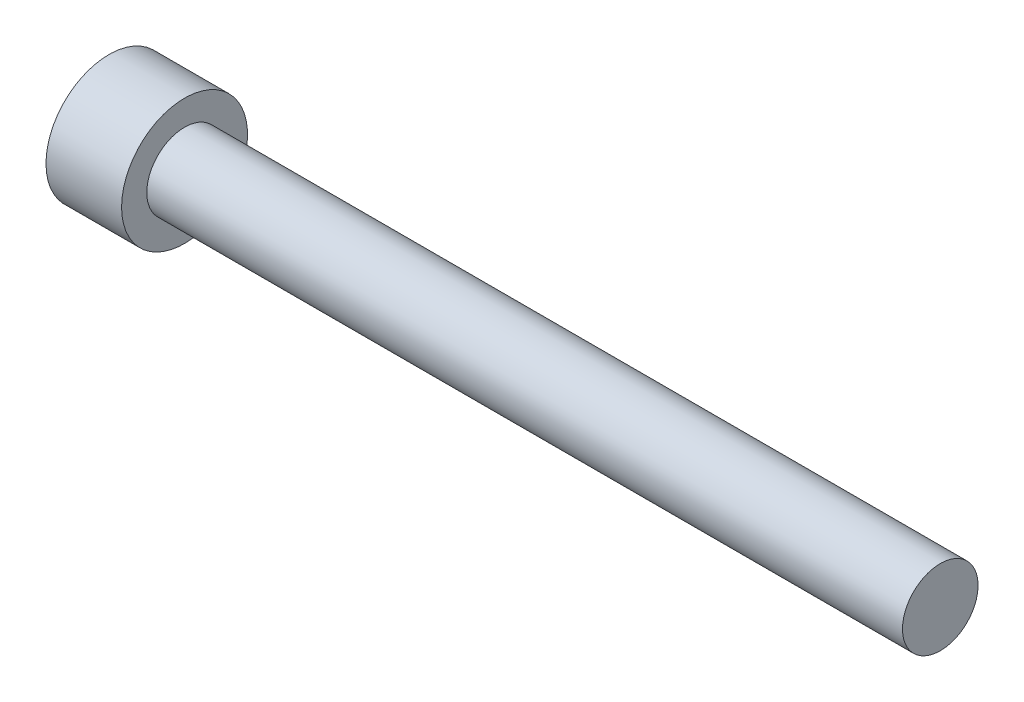
ISO-10303-21;
HEADER;
FILE_DESCRIPTION(('STEP AP214'),'2;1');
FILE_NAME('part.step','',(''),(''),'','','');
FILE_SCHEMA(('AUTOMOTIVE_DESIGN { 1 0 10303 214 1 1 1 1 }'));
ENDSEC;
DATA;
#1=APPLICATION_CONTEXT('core data for automotive mechanical design processes');
#2=APPLICATION_PROTOCOL_DEFINITION('international standard','automotive_design',2000,#1);
#3=PRODUCT_CONTEXT('',#1,'mechanical');
#4=PRODUCT('Part','Part','',(#3));
#5=PRODUCT_RELATED_PRODUCT_CATEGORY('part','',(#4));
#6=PRODUCT_DEFINITION_FORMATION('','',#4);
#7=PRODUCT_DEFINITION_CONTEXT('part definition',#1,'design');
#8=PRODUCT_DEFINITION('design','',#6,#7);
#9=PRODUCT_DEFINITION_SHAPE('','',#8);
#10=(LENGTH_UNIT() NAMED_UNIT(*) SI_UNIT(.MILLI.,.METRE.));
#11=(NAMED_UNIT(*) PLANE_ANGLE_UNIT() SI_UNIT($,.RADIAN.));
#12=(NAMED_UNIT(*) SI_UNIT($,.STERADIAN.) SOLID_ANGLE_UNIT());
#13=UNCERTAINTY_MEASURE_WITH_UNIT(LENGTH_MEASURE(1.E-05),#10,'distance_accuracy_value','');
#14=(GEOMETRIC_REPRESENTATION_CONTEXT(3) GLOBAL_UNCERTAINTY_ASSIGNED_CONTEXT((#13)) GLOBAL_UNIT_ASSIGNED_CONTEXT((#10,
#11,#12)) REPRESENTATION_CONTEXT('',''));
#15=CARTESIAN_POINT('',(0.,0.,0.));
#16=DIRECTION('',(0.,0.,1.));
#17=DIRECTION('',(1.,0.,0.));
#18=AXIS2_PLACEMENT_3D('',#15,#16,#17);
#19=CARTESIAN_POINT('',(-6.,0.,0.));
#20=DIRECTION('',(1.,0.,0.));
#21=DIRECTION('',(0.,0.,-1.));
#22=AXIS2_PLACEMENT_3D('',#19,#20,#21);
#23=PLANE('',#22);
#24=CARTESIAN_POINT('',(-6.00000000000001,0.,0.));
#25=DIRECTION('',(-1.,0.,0.));
#26=DIRECTION('',(0.,0.,1.));
#27=AXIS2_PLACEMENT_3D('',#24,#25,#26);
#28=CIRCLE('',#27,5.);
#29=CARTESIAN_POINT('',(-6.00000000000001,0.,5.));
#30=VERTEX_POINT('',#29);
#31=EDGE_CURVE('E11',#30,#30,#28,.T.);
#32=ORIENTED_EDGE('',*,*,#31,.T.);
#33=EDGE_LOOP('',(#32));
#34=FACE_BOUND('',#33,.T.);
#35=DIRECTION('',(0.,0.866025403784439,-0.5));
#36=VECTOR('',#35,1.);
#37=CARTESIAN_POINT('',(-6.,-2.5,-1.44337567297406));
#38=LINE('',#37,#36);
#39=CARTESIAN_POINT('',(-6.,-2.5,-1.44337567297406));
#40=VERTEX_POINT('',#39);
#41=CARTESIAN_POINT('',(-6.,0.,-2.88675134594813));
#42=VERTEX_POINT('',#41);
#43=EDGE_CURVE('E54',#40,#42,#38,.T.);
#44=ORIENTED_EDGE('',*,*,#43,.T.);
#45=DIRECTION('',(0.,0.866025403784439,0.5));
#46=VECTOR('',#45,1.);
#47=CARTESIAN_POINT('',(-6.,0.,-2.88675134594813));
#48=LINE('',#47,#46);
#49=CARTESIAN_POINT('',(-6.,2.5,-1.44337567297406));
#50=VERTEX_POINT('',#49);
#51=EDGE_CURVE('E127',#42,#50,#48,.T.);
#52=ORIENTED_EDGE('',*,*,#51,.T.);
#53=DIRECTION('',(0.,0.,1.));
#54=VECTOR('',#53,1.);
#55=CARTESIAN_POINT('',(-6.,2.5,-1.44337567297406));
#56=LINE('',#55,#54);
#57=CARTESIAN_POINT('',(-6.,2.5,1.44337567297406));
#58=VERTEX_POINT('',#57);
#59=EDGE_CURVE('E129',#50,#58,#56,.T.);
#60=ORIENTED_EDGE('',*,*,#59,.T.);
#61=DIRECTION('',(0.,-0.866025403784439,0.5));
#62=VECTOR('',#61,1.);
#63=CARTESIAN_POINT('',(-6.,2.5,1.44337567297406));
#64=LINE('',#63,#62);
#65=CARTESIAN_POINT('',(-6.,0.,2.88675134594813));
#66=VERTEX_POINT('',#65);
#67=EDGE_CURVE('E134',#58,#66,#64,.T.);
#68=ORIENTED_EDGE('',*,*,#67,.T.);
#69=DIRECTION('',(0.,-0.866025403784439,-0.5));
#70=VECTOR('',#69,1.);
#71=CARTESIAN_POINT('',(-6.,0.,2.88675134594813));
#72=LINE('',#71,#70);
#73=CARTESIAN_POINT('',(-6.,-2.5,1.44337567297407));
#74=VERTEX_POINT('',#73);
#75=EDGE_CURVE('E118',#66,#74,#72,.T.);
#76=ORIENTED_EDGE('',*,*,#75,.T.);
#77=DIRECTION('',(0.,0.,-1.));
#78=VECTOR('',#77,1.);
#79=CARTESIAN_POINT('',(-6.,-2.5,1.44337567297407));
#80=LINE('',#79,#78);
#81=EDGE_CURVE('E131',#74,#40,#80,.T.);
#82=ORIENTED_EDGE('',*,*,#81,.T.);
#83=EDGE_LOOP('',(#44,#52,#60,#68,#76,#82));
#84=FACE_BOUND('',#83,.T.);
#85=ADVANCED_FACE('F41',(#34,#84),#23,.F.);
#86=CARTESIAN_POINT('',(-1000.,0.,0.));
#87=DIRECTION('',(-1.,0.,0.));
#88=DIRECTION('',(0.,0.,1.));
#89=AXIS2_PLACEMENT_3D('',#86,#87,#88);
#90=CYLINDRICAL_SURFACE('',#89,5.);
#91=ORIENTED_EDGE('',*,*,#31,.F.);
#92=EDGE_LOOP('',(#91));
#93=FACE_BOUND('',#92,.T.);
#94=CARTESIAN_POINT('',(0.,0.,0.));
#95=DIRECTION('',(-1.,0.,0.));
#96=DIRECTION('',(0.,0.,1.));
#97=AXIS2_PLACEMENT_3D('',#94,#95,#96);
#98=CIRCLE('',#97,5.);
#99=CARTESIAN_POINT('',(0.,0.,5.));
#100=VERTEX_POINT('',#99);
#101=EDGE_CURVE('E48',#100,#100,#98,.T.);
#102=ORIENTED_EDGE('',*,*,#101,.T.);
#103=EDGE_LOOP('',(#102));
#104=FACE_BOUND('',#103,.T.);
#105=ADVANCED_FACE('F152',(#93,#104),#90,.T.);
#106=CARTESIAN_POINT('',(0.,5.,0.));
#107=DIRECTION('',(-1.,0.,0.));
#108=DIRECTION('',(0.,0.,1.));
#109=AXIS2_PLACEMENT_3D('',#106,#107,#108);
#110=PLANE('',#109);
#111=ORIENTED_EDGE('',*,*,#101,.F.);
#112=EDGE_LOOP('',(#111));
#113=FACE_BOUND('',#112,.T.);
#114=CARTESIAN_POINT('',(0.,0.,0.));
#115=DIRECTION('',(-1.,0.,0.));
#116=DIRECTION('',(0.,0.,1.));
#117=AXIS2_PLACEMENT_3D('',#114,#115,#116);
#118=CIRCLE('',#117,3.);
#119=CARTESIAN_POINT('',(0.,0.,3.));
#120=VERTEX_POINT('',#119);
#121=EDGE_CURVE('E149',#120,#120,#118,.T.);
#122=ORIENTED_EDGE('',*,*,#121,.T.);
#123=EDGE_LOOP('',(#122));
#124=FACE_BOUND('',#123,.T.);
#125=ADVANCED_FACE('F156',(#113,#124),#110,.F.);
#126=CARTESIAN_POINT('',(-1000.,0.,0.));
#127=DIRECTION('',(-1.,0.,0.));
#128=DIRECTION('',(0.,0.,1.));
#129=AXIS2_PLACEMENT_3D('',#126,#127,#128);
#130=CYLINDRICAL_SURFACE('',#129,3.);
#131=ORIENTED_EDGE('',*,*,#121,.F.);
#132=EDGE_LOOP('',(#131));
#133=FACE_BOUND('',#132,.T.);
#134=CARTESIAN_POINT('',(60.0000000000001,0.,0.));
#135=DIRECTION('',(-1.,0.,0.));
#136=DIRECTION('',(0.,0.,1.));
#137=AXIS2_PLACEMENT_3D('',#134,#135,#136);
#138=CIRCLE('',#137,3.);
#139=CARTESIAN_POINT('',(60.0000000000001,0.,3.));
#140=VERTEX_POINT('',#139);
#141=EDGE_CURVE('E148',#140,#140,#138,.T.);
#142=ORIENTED_EDGE('',*,*,#141,.T.);
#143=EDGE_LOOP('',(#142));
#144=FACE_BOUND('',#143,.T.);
#145=ADVANCED_FACE('F157',(#133,#144),#130,.T.);
#146=CARTESIAN_POINT('',(60.,3.,0.));
#147=DIRECTION('',(-1.,0.,0.));
#148=DIRECTION('',(0.,0.,1.));
#149=AXIS2_PLACEMENT_3D('',#146,#147,#148);
#150=PLANE('',#149);
#151=ORIENTED_EDGE('',*,*,#141,.F.);
#152=EDGE_LOOP('',(#151));
#153=FACE_BOUND('',#152,.T.);
#154=ADVANCED_FACE('F164',(#153),#150,.F.);
#155=CARTESIAN_POINT('',(-3.,-2.5,-1.44337567297406));
#156=DIRECTION('',(0.,0.5,0.866025403784439));
#157=DIRECTION('',(0.,-0.866025403784439,0.5));
#158=AXIS2_PLACEMENT_3D('',#155,#156,#157);
#159=PLANE('',#158);
#160=ORIENTED_EDGE('',*,*,#43,.F.);
#161=DIRECTION('',(-1.,0.,0.));
#162=VECTOR('',#161,1.);
#163=CARTESIAN_POINT('',(-3.,-2.5,-1.44337567297406));
#164=LINE('',#163,#162);
#165=CARTESIAN_POINT('',(-3.,-2.5,-1.44337567297406));
#166=VERTEX_POINT('',#165);
#167=EDGE_CURVE('E121',#166,#40,#164,.T.);
#168=ORIENTED_EDGE('',*,*,#167,.F.);
#169=DIRECTION('',(0.,0.866025403784439,-0.5));
#170=VECTOR('',#169,1.);
#171=CARTESIAN_POINT('',(-3.,-2.5,-1.44337567297406));
#172=LINE('',#171,#170);
#173=CARTESIAN_POINT('',(-3.,0.,-2.88675134594813));
#174=VERTEX_POINT('',#173);
#175=EDGE_CURVE('E137',#166,#174,#172,.T.);
#176=ORIENTED_EDGE('',*,*,#175,.T.);
#177=DIRECTION('',(-1.,0.,0.));
#178=VECTOR('',#177,1.);
#179=CARTESIAN_POINT('',(-3.,0.,-2.88675134594813));
#180=LINE('',#179,#178);
#181=EDGE_CURVE('E145',#174,#42,#180,.T.);
#182=ORIENTED_EDGE('',*,*,#181,.T.);
#183=EDGE_LOOP('',(#160,#168,#176,#182));
#184=FACE_BOUND('',#183,.T.);
#185=ADVANCED_FACE('F168',(#184),#159,.T.);
#186=CARTESIAN_POINT('',(-3.,0.,-2.88675134594813));
#187=DIRECTION('',(0.,-0.5,0.866025403784439));
#188=DIRECTION('',(0.,-0.866025403784439,-0.5));
#189=AXIS2_PLACEMENT_3D('',#186,#187,#188);
#190=PLANE('',#189);
#191=ORIENTED_EDGE('',*,*,#51,.F.);
#192=ORIENTED_EDGE('',*,*,#181,.F.);
#193=DIRECTION('',(0.,0.866025403784439,0.5));
#194=VECTOR('',#193,1.);
#195=CARTESIAN_POINT('',(-3.,0.,-2.88675134594813));
#196=LINE('',#195,#194);
#197=CARTESIAN_POINT('',(-3.,2.5,-1.44337567297406));
#198=VERTEX_POINT('',#197);
#199=EDGE_CURVE('E94',#174,#198,#196,.T.);
#200=ORIENTED_EDGE('',*,*,#199,.T.);
#201=DIRECTION('',(-1.,0.,0.));
#202=VECTOR('',#201,1.);
#203=CARTESIAN_POINT('',(-3.,2.5,-1.44337567297406));
#204=LINE('',#203,#202);
#205=EDGE_CURVE('E142',#198,#50,#204,.T.);
#206=ORIENTED_EDGE('',*,*,#205,.T.);
#207=EDGE_LOOP('',(#191,#192,#200,#206));
#208=FACE_BOUND('',#207,.T.);
#209=ADVANCED_FACE('F176',(#208),#190,.T.);
#210=CARTESIAN_POINT('',(-3.,2.5,-1.44337567297406));
#211=DIRECTION('',(0.,-1.,0.));
#212=DIRECTION('',(0.,0.,-1.));
#213=AXIS2_PLACEMENT_3D('',#210,#211,#212);
#214=PLANE('',#213);
#215=ORIENTED_EDGE('',*,*,#59,.F.);
#216=ORIENTED_EDGE('',*,*,#205,.F.);
#217=DIRECTION('',(0.,0.,1.));
#218=VECTOR('',#217,1.);
#219=CARTESIAN_POINT('',(-3.,2.5,-1.44337567297406));
#220=LINE('',#219,#218);
#221=CARTESIAN_POINT('',(-3.,2.5,1.44337567297406));
#222=VERTEX_POINT('',#221);
#223=EDGE_CURVE('E115',#198,#222,#220,.T.);
#224=ORIENTED_EDGE('',*,*,#223,.T.);
#225=DIRECTION('',(-1.,0.,0.));
#226=VECTOR('',#225,1.);
#227=CARTESIAN_POINT('',(-3.,2.5,1.44337567297406));
#228=LINE('',#227,#226);
#229=EDGE_CURVE('E108',#222,#58,#228,.T.);
#230=ORIENTED_EDGE('',*,*,#229,.T.);
#231=EDGE_LOOP('',(#215,#216,#224,#230));
#232=FACE_BOUND('',#231,.T.);
#233=ADVANCED_FACE('F195',(#232),#214,.T.);
#234=CARTESIAN_POINT('',(-3.,2.5,1.44337567297406));
#235=DIRECTION('',(0.,-0.5,-0.866025403784438));
#236=DIRECTION('',(0.,0.866025403784439,-0.5));
#237=AXIS2_PLACEMENT_3D('',#234,#235,#236);
#238=PLANE('',#237);
#239=ORIENTED_EDGE('',*,*,#67,.F.);
#240=ORIENTED_EDGE('',*,*,#229,.F.);
#241=DIRECTION('',(0.,-0.866025403784439,0.5));
#242=VECTOR('',#241,1.);
#243=CARTESIAN_POINT('',(-3.,2.5,1.44337567297406));
#244=LINE('',#243,#242);
#245=CARTESIAN_POINT('',(-3.,0.,2.88675134594813));
#246=VERTEX_POINT('',#245);
#247=EDGE_CURVE('E102',#222,#246,#244,.T.);
#248=ORIENTED_EDGE('',*,*,#247,.T.);
#249=DIRECTION('',(-1.,0.,0.));
#250=VECTOR('',#249,1.);
#251=CARTESIAN_POINT('',(-3.,0.,2.88675134594813));
#252=LINE('',#251,#250);
#253=EDGE_CURVE('E107',#246,#66,#252,.T.);
#254=ORIENTED_EDGE('',*,*,#253,.T.);
#255=EDGE_LOOP('',(#239,#240,#248,#254));
#256=FACE_BOUND('',#255,.T.);
#257=ADVANCED_FACE('F110',(#256),#238,.T.);
#258=CARTESIAN_POINT('',(-3.,0.,2.88675134594813));
#259=DIRECTION('',(0.,0.5,-0.866025403784439));
#260=DIRECTION('',(0.,0.866025403784439,0.5));
#261=AXIS2_PLACEMENT_3D('',#258,#259,#260);
#262=PLANE('',#261);
#263=ORIENTED_EDGE('',*,*,#75,.F.);
#264=ORIENTED_EDGE('',*,*,#253,.F.);
#265=DIRECTION('',(0.,-0.866025403784439,-0.5));
#266=VECTOR('',#265,1.);
#267=CARTESIAN_POINT('',(-3.,0.,2.88675134594813));
#268=LINE('',#267,#266);
#269=CARTESIAN_POINT('',(-3.,-2.5,1.44337567297407));
#270=VERTEX_POINT('',#269);
#271=EDGE_CURVE('E112',#246,#270,#268,.T.);
#272=ORIENTED_EDGE('',*,*,#271,.T.);
#273=DIRECTION('',(-1.,0.,0.));
#274=VECTOR('',#273,1.);
#275=CARTESIAN_POINT('',(-3.,-2.5,1.44337567297407));
#276=LINE('',#275,#274);
#277=EDGE_CURVE('E84',#270,#74,#276,.T.);
#278=ORIENTED_EDGE('',*,*,#277,.T.);
#279=EDGE_LOOP('',(#263,#264,#272,#278));
#280=FACE_BOUND('',#279,.T.);
#281=ADVANCED_FACE('F111',(#280),#262,.T.);
#282=CARTESIAN_POINT('',(-3.,-2.5,1.44337567297407));
#283=DIRECTION('',(0.,1.,0.));
#284=DIRECTION('',(0.,0.,1.));
#285=AXIS2_PLACEMENT_3D('',#282,#283,#284);
#286=PLANE('',#285);
#287=ORIENTED_EDGE('',*,*,#81,.F.);
#288=ORIENTED_EDGE('',*,*,#277,.F.);
#289=DIRECTION('',(0.,0.,-1.));
#290=VECTOR('',#289,1.);
#291=CARTESIAN_POINT('',(-3.,-2.5,1.44337567297407));
#292=LINE('',#291,#290);
#293=EDGE_CURVE('E62',#270,#166,#292,.T.);
#294=ORIENTED_EDGE('',*,*,#293,.T.);
#295=ORIENTED_EDGE('',*,*,#167,.T.);
#296=EDGE_LOOP('',(#287,#288,#294,#295));
#297=FACE_BOUND('',#296,.T.);
#298=ADVANCED_FACE('F183',(#297),#286,.T.);
#299=CARTESIAN_POINT('',(-3.,0.,0.));
#300=DIRECTION('',(1.,0.,0.));
#301=DIRECTION('',(0.,0.,-1.));
#302=AXIS2_PLACEMENT_3D('',#299,#300,#301);
#303=PLANE('',#302);
#304=ORIENTED_EDGE('',*,*,#175,.F.);
#305=ORIENTED_EDGE('',*,*,#293,.F.);
#306=ORIENTED_EDGE('',*,*,#271,.F.);
#307=ORIENTED_EDGE('',*,*,#247,.F.);
#308=ORIENTED_EDGE('',*,*,#223,.F.);
#309=ORIENTED_EDGE('',*,*,#199,.F.);
#310=EDGE_LOOP('',(#304,#305,#306,#307,#308,#309));
#311=FACE_BOUND('',#310,.T.);
#312=ADVANCED_FACE('F120',(#311),#303,.F.);
#313=CLOSED_SHELL('',(#85,#105,#125,#145,#154,#185,#209,#233,#257,#281,#298,#312));
#314=MANIFOLD_SOLID_BREP('B2',#313);
#315=ADVANCED_BREP_SHAPE_REPRESENTATION('',(#18,#314),#14);
#316=SHAPE_DEFINITION_REPRESENTATION(#9,#315);
ENDSEC;
END-ISO-10303-21;
